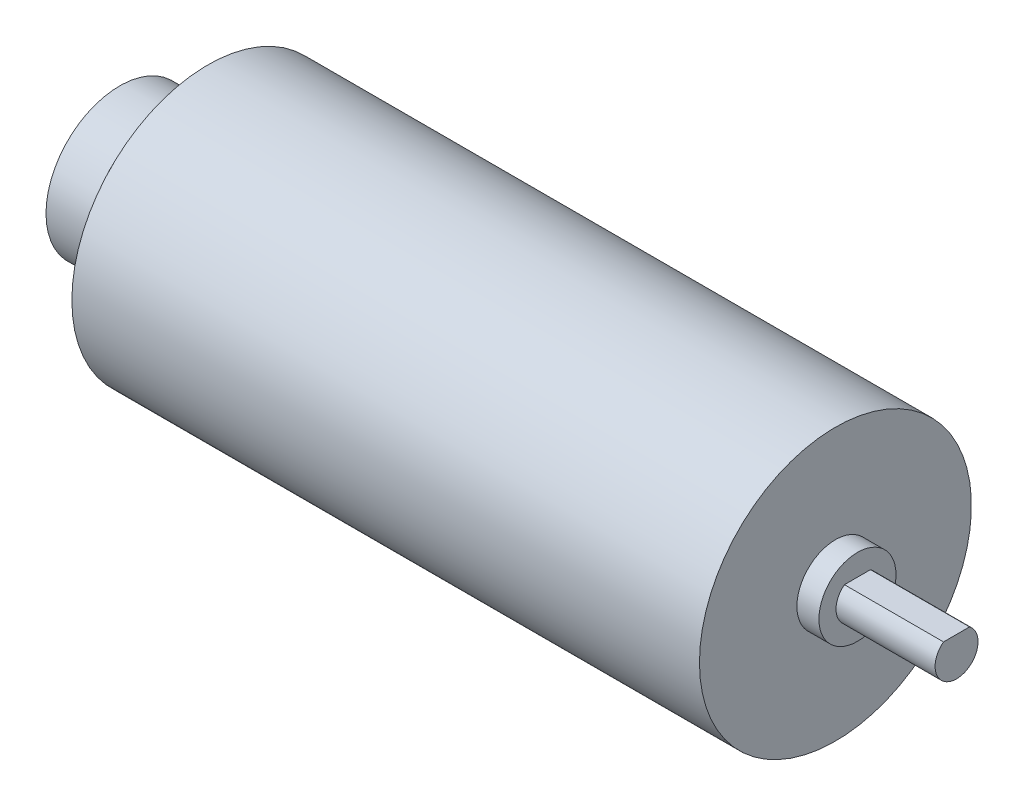
ISO-10303-21;
HEADER;
FILE_DESCRIPTION(('STEP AP214'),'2;1');
FILE_NAME('part.step','',(''),(''),'','','');
FILE_SCHEMA(('AUTOMOTIVE_DESIGN { 1 0 10303 214 1 1 1 1 }'));
ENDSEC;
DATA;
#1=APPLICATION_CONTEXT('core data for automotive mechanical design processes');
#2=APPLICATION_PROTOCOL_DEFINITION('international standard','automotive_design',2000,#1);
#3=PRODUCT_CONTEXT('',#1,'mechanical');
#4=PRODUCT('Part','Part','',(#3));
#5=PRODUCT_RELATED_PRODUCT_CATEGORY('part','',(#4));
#6=PRODUCT_DEFINITION_FORMATION('','',#4);
#7=PRODUCT_DEFINITION_CONTEXT('part definition',#1,'design');
#8=PRODUCT_DEFINITION('design','',#6,#7);
#9=PRODUCT_DEFINITION_SHAPE('','',#8);
#10=(LENGTH_UNIT() NAMED_UNIT(*) SI_UNIT(.MILLI.,.METRE.));
#11=(NAMED_UNIT(*) PLANE_ANGLE_UNIT() SI_UNIT($,.RADIAN.));
#12=(NAMED_UNIT(*) SI_UNIT($,.STERADIAN.) SOLID_ANGLE_UNIT());
#13=UNCERTAINTY_MEASURE_WITH_UNIT(LENGTH_MEASURE(1.E-05),#10,'distance_accuracy_value','');
#14=(GEOMETRIC_REPRESENTATION_CONTEXT(3) GLOBAL_UNCERTAINTY_ASSIGNED_CONTEXT((#13)) GLOBAL_UNIT_ASSIGNED_CONTEXT((#10,
#11,#12)) REPRESENTATION_CONTEXT('',''));
#15=CARTESIAN_POINT('',(0.,0.,0.));
#16=DIRECTION('',(0.,0.,1.));
#17=DIRECTION('',(1.,0.,0.));
#18=AXIS2_PLACEMENT_3D('',#15,#16,#17);
#19=CARTESIAN_POINT('',(30.5,0.,0.));
#20=DIRECTION('',(1.,0.,0.));
#21=DIRECTION('',(0.,0.,-1.));
#22=AXIS2_PLACEMENT_3D('',#19,#20,#21);
#23=PLANE('',#22);
#24=CARTESIAN_POINT('',(30.5,0.,0.));
#25=DIRECTION('',(1.,0.,0.));
#26=DIRECTION('',(0.,0.,-1.));
#27=AXIS2_PLACEMENT_3D('',#24,#25,#26);
#28=CIRCLE('',#27,3.5);
#29=CARTESIAN_POINT('',(30.5,0.,-3.5));
#30=VERTEX_POINT('',#29);
#31=EDGE_CURVE('E87',#30,#30,#28,.T.);
#32=ORIENTED_EDGE('',*,*,#31,.T.);
#33=EDGE_LOOP('',(#32));
#34=FACE_BOUND('',#33,.T.);
#35=DIRECTION('',(0.,0.,-1.));
#36=VECTOR('',#35,1.);
#37=CARTESIAN_POINT('',(30.5,1.55,0.));
#38=LINE('',#37,#36);
#39=CARTESIAN_POINT('',(30.5,1.55,1.18321595661992));
#40=VERTEX_POINT('',#39);
#41=CARTESIAN_POINT('',(30.5,1.55,-1.18321595661992));
#42=VERTEX_POINT('',#41);
#43=EDGE_CURVE('E48',#40,#42,#38,.T.);
#44=ORIENTED_EDGE('',*,*,#43,.T.);
#45=CARTESIAN_POINT('',(30.5,0.,0.));
#46=DIRECTION('',(1.,0.,0.));
#47=DIRECTION('',(0.,0.,-1.));
#48=AXIS2_PLACEMENT_3D('',#45,#46,#47);
#49=CIRCLE('',#48,1.95);
#50=EDGE_CURVE('E69',#40,#42,#49,.T.);
#51=ORIENTED_EDGE('',*,*,#50,.F.);
#52=EDGE_LOOP('',(#44,#51));
#53=FACE_BOUND('',#52,.T.);
#54=ADVANCED_FACE('F33',(#34,#53),#23,.T.);
#55=CARTESIAN_POINT('',(-28.5,0.,-12.35));
#56=DIRECTION('',(1.,0.,0.));
#57=DIRECTION('',(0.,0.,-1.));
#58=AXIS2_PLACEMENT_3D('',#55,#56,#57);
#59=PLANE('',#58);
#60=CARTESIAN_POINT('',(-28.5,0.,0.));
#61=DIRECTION('',(1.,0.,0.));
#62=DIRECTION('',(0.,0.,-1.));
#63=AXIS2_PLACEMENT_3D('',#60,#61,#62);
#64=CIRCLE('',#63,0.75);
#65=CARTESIAN_POINT('',(-28.5,0.,-0.75));
#66=VERTEX_POINT('',#65);
#67=EDGE_CURVE('E11',#66,#66,#64,.F.);
#68=ORIENTED_EDGE('',*,*,#67,.F.);
#69=EDGE_LOOP('',(#68));
#70=FACE_BOUND('',#69,.T.);
#71=CARTESIAN_POINT('',(-28.5,0.,0.));
#72=DIRECTION('',(-1.,0.,0.));
#73=DIRECTION('',(0.,0.,1.));
#74=AXIS2_PLACEMENT_3D('',#71,#72,#73);
#75=CIRCLE('',#74,12.35);
#76=CARTESIAN_POINT('',(-28.5,0.,12.35));
#77=VERTEX_POINT('',#76);
#78=EDGE_CURVE('E90',#77,#77,#75,.T.);
#79=ORIENTED_EDGE('',*,*,#78,.T.);
#80=EDGE_LOOP('',(#79));
#81=FACE_BOUND('',#80,.T.);
#82=ADVANCED_FACE('F35',(#70,#81),#59,.F.);
#83=CARTESIAN_POINT('',(28.5,0.,-12.35));
#84=DIRECTION('',(-1.,0.,0.));
#85=DIRECTION('',(0.,0.,1.));
#86=AXIS2_PLACEMENT_3D('',#83,#84,#85);
#87=PLANE('',#86);
#88=CARTESIAN_POINT('',(28.5,0.,0.));
#89=DIRECTION('',(-1.,0.,0.));
#90=DIRECTION('',(0.,0.,1.));
#91=AXIS2_PLACEMENT_3D('',#88,#89,#90);
#92=CIRCLE('',#91,3.5);
#93=CARTESIAN_POINT('',(28.5,0.,3.5));
#94=VERTEX_POINT('',#93);
#95=EDGE_CURVE('E41',#94,#94,#92,.F.);
#96=ORIENTED_EDGE('',*,*,#95,.F.);
#97=EDGE_LOOP('',(#96));
#98=FACE_BOUND('',#97,.T.);
#99=CARTESIAN_POINT('',(28.5,0.,0.));
#100=DIRECTION('',(-1.,0.,0.));
#101=DIRECTION('',(0.,0.,1.));
#102=AXIS2_PLACEMENT_3D('',#99,#100,#101);
#103=CIRCLE('',#102,12.35);
#104=CARTESIAN_POINT('',(28.5,0.,12.35));
#105=VERTEX_POINT('',#104);
#106=EDGE_CURVE('E93',#105,#105,#103,.T.);
#107=ORIENTED_EDGE('',*,*,#106,.F.);
#108=EDGE_LOOP('',(#107));
#109=FACE_BOUND('',#108,.T.);
#110=ADVANCED_FACE('F100',(#98,#109),#87,.F.);
#111=CARTESIAN_POINT('',(-28.5,0.,0.));
#112=DIRECTION('',(-1.,0.,0.));
#113=DIRECTION('',(0.,0.,1.));
#114=AXIS2_PLACEMENT_3D('',#111,#112,#113);
#115=CYLINDRICAL_SURFACE('',#114,12.35);
#116=ORIENTED_EDGE('',*,*,#78,.F.);
#117=EDGE_LOOP('',(#116));
#118=FACE_BOUND('',#117,.T.);
#119=ORIENTED_EDGE('',*,*,#106,.T.);
#120=EDGE_LOOP('',(#119));
#121=FACE_BOUND('',#120,.T.);
#122=ADVANCED_FACE('F103',(#118,#121),#115,.T.);
#123=CARTESIAN_POINT('',(30.5,0.,0.));
#124=DIRECTION('',(-1.,0.,0.));
#125=DIRECTION('',(0.,0.,1.));
#126=AXIS2_PLACEMENT_3D('',#123,#124,#125);
#127=CYLINDRICAL_SURFACE('',#126,3.5);
#128=ORIENTED_EDGE('',*,*,#31,.F.);
#129=EDGE_LOOP('',(#128));
#130=FACE_BOUND('',#129,.T.);
#131=ORIENTED_EDGE('',*,*,#95,.T.);
#132=EDGE_LOOP('',(#131));
#133=FACE_BOUND('',#132,.T.);
#134=ADVANCED_FACE('F98',(#130,#133),#127,.T.);
#135=CARTESIAN_POINT('',(-32.5,0.,0.));
#136=DIRECTION('',(1.,0.,0.));
#137=DIRECTION('',(0.,0.,-1.));
#138=AXIS2_PLACEMENT_3D('',#135,#136,#137);
#139=CYLINDRICAL_SURFACE('',#138,0.75);
#140=CARTESIAN_POINT('',(-32.5,0.,0.));
#141=DIRECTION('',(-1.,0.,0.));
#142=DIRECTION('',(0.,0.,1.));
#143=AXIS2_PLACEMENT_3D('',#140,#141,#142);
#144=CIRCLE('',#143,0.75);
#145=CARTESIAN_POINT('',(-32.5,0.,0.75));
#146=VERTEX_POINT('',#145);
#147=EDGE_CURVE('E82',#146,#146,#144,.T.);
#148=ORIENTED_EDGE('',*,*,#147,.F.);
#149=EDGE_LOOP('',(#148));
#150=FACE_BOUND('',#149,.T.);
#151=ORIENTED_EDGE('',*,*,#67,.T.);
#152=EDGE_LOOP('',(#151));
#153=FACE_BOUND('',#152,.T.);
#154=ADVANCED_FACE('F112',(#150,#153),#139,.T.);
#155=CARTESIAN_POINT('',(-36.5,0.,0.));
#156=DIRECTION('',(1.,0.,0.));
#157=DIRECTION('',(0.,0.,-1.));
#158=AXIS2_PLACEMENT_3D('',#155,#156,#157);
#159=CYLINDRICAL_SURFACE('',#158,6.7);
#160=CARTESIAN_POINT('',(-36.5,0.,0.));
#161=DIRECTION('',(-1.,0.,0.));
#162=DIRECTION('',(0.,0.,1.));
#163=AXIS2_PLACEMENT_3D('',#160,#161,#162);
#164=CIRCLE('',#163,6.7);
#165=CARTESIAN_POINT('',(-36.5,0.,6.7));
#166=VERTEX_POINT('',#165);
#167=EDGE_CURVE('E79',#166,#166,#164,.T.);
#168=ORIENTED_EDGE('',*,*,#167,.F.);
#169=EDGE_LOOP('',(#168));
#170=FACE_BOUND('',#169,.T.);
#171=CARTESIAN_POINT('',(-32.5,0.,0.));
#172=DIRECTION('',(-1.,0.,0.));
#173=DIRECTION('',(0.,0.,1.));
#174=AXIS2_PLACEMENT_3D('',#171,#172,#173);
#175=CIRCLE('',#174,6.7);
#176=CARTESIAN_POINT('',(-32.5,0.,6.7));
#177=VERTEX_POINT('',#176);
#178=EDGE_CURVE('E78',#177,#177,#175,.T.);
#179=ORIENTED_EDGE('',*,*,#178,.T.);
#180=EDGE_LOOP('',(#179));
#181=FACE_BOUND('',#180,.T.);
#182=ADVANCED_FACE('F126',(#170,#181),#159,.T.);
#183=CARTESIAN_POINT('',(-36.5,0.,0.));
#184=DIRECTION('',(-1.,0.,0.));
#185=DIRECTION('',(0.,0.,1.));
#186=AXIS2_PLACEMENT_3D('',#183,#184,#185);
#187=PLANE('',#186);
#188=ORIENTED_EDGE('',*,*,#167,.T.);
#189=EDGE_LOOP('',(#188));
#190=FACE_BOUND('',#189,.T.);
#191=ADVANCED_FACE('F130',(#190),#187,.T.);
#192=CARTESIAN_POINT('',(-32.5,0.,0.));
#193=DIRECTION('',(-1.,0.,0.));
#194=DIRECTION('',(0.,0.,1.));
#195=AXIS2_PLACEMENT_3D('',#192,#193,#194);
#196=PLANE('',#195);
#197=ORIENTED_EDGE('',*,*,#147,.T.);
#198=EDGE_LOOP('',(#197));
#199=FACE_BOUND('',#198,.T.);
#200=ORIENTED_EDGE('',*,*,#178,.F.);
#201=EDGE_LOOP('',(#200));
#202=FACE_BOUND('',#201,.T.);
#203=ADVANCED_FACE('F132',(#199,#202),#196,.F.);
#204=CARTESIAN_POINT('',(39.5,1.55,0.));
#205=DIRECTION('',(0.,1.,0.));
#206=DIRECTION('',(0.,0.,1.));
#207=AXIS2_PLACEMENT_3D('',#204,#205,#206);
#208=PLANE('',#207);
#209=ORIENTED_EDGE('',*,*,#43,.F.);
#210=DIRECTION('',(-1.,0.,0.));
#211=VECTOR('',#210,1.);
#212=CARTESIAN_POINT('',(39.5,1.55,1.18321595661992));
#213=LINE('',#212,#211);
#214=CARTESIAN_POINT('',(39.5,1.55,1.18321595661992));
#215=VERTEX_POINT('',#214);
#216=EDGE_CURVE('E66',#215,#40,#213,.T.);
#217=ORIENTED_EDGE('',*,*,#216,.F.);
#218=DIRECTION('',(0.,0.,-1.));
#219=VECTOR('',#218,1.);
#220=CARTESIAN_POINT('',(39.5,1.55,0.));
#221=LINE('',#220,#219);
#222=CARTESIAN_POINT('',(39.5,1.55,-1.18321595661992));
#223=VERTEX_POINT('',#222);
#224=EDGE_CURVE('E64',#215,#223,#221,.T.);
#225=ORIENTED_EDGE('',*,*,#224,.T.);
#226=DIRECTION('',(-1.,0.,0.));
#227=VECTOR('',#226,1.);
#228=CARTESIAN_POINT('',(39.5,1.55,-1.18321595661992));
#229=LINE('',#228,#227);
#230=EDGE_CURVE('E61',#223,#42,#229,.T.);
#231=ORIENTED_EDGE('',*,*,#230,.T.);
#232=EDGE_LOOP('',(#209,#217,#225,#231));
#233=FACE_BOUND('',#232,.T.);
#234=ADVANCED_FACE('F63',(#233),#208,.T.);
#235=CARTESIAN_POINT('',(39.5,0.,0.));
#236=DIRECTION('',(-1.,0.,0.));
#237=DIRECTION('',(0.,0.,1.));
#238=AXIS2_PLACEMENT_3D('',#235,#236,#237);
#239=CYLINDRICAL_SURFACE('',#238,1.95);
#240=ORIENTED_EDGE('',*,*,#50,.T.);
#241=ORIENTED_EDGE('',*,*,#230,.F.);
#242=CARTESIAN_POINT('',(39.5,0.,0.));
#243=DIRECTION('',(1.,0.,0.));
#244=DIRECTION('',(0.,0.,-1.));
#245=AXIS2_PLACEMENT_3D('',#242,#243,#244);
#246=CIRCLE('',#245,1.95);
#247=EDGE_CURVE('E56',#215,#223,#246,.T.);
#248=ORIENTED_EDGE('',*,*,#247,.F.);
#249=ORIENTED_EDGE('',*,*,#216,.T.);
#250=EDGE_LOOP('',(#240,#241,#248,#249));
#251=FACE_BOUND('',#250,.T.);
#252=ADVANCED_FACE('F70',(#251),#239,.T.);
#253=CARTESIAN_POINT('',(39.5,0.,0.));
#254=DIRECTION('',(1.,0.,0.));
#255=DIRECTION('',(0.,0.,-1.));
#256=AXIS2_PLACEMENT_3D('',#253,#254,#255);
#257=PLANE('',#256);
#258=ORIENTED_EDGE('',*,*,#224,.F.);
#259=ORIENTED_EDGE('',*,*,#247,.T.);
#260=EDGE_LOOP('',(#258,#259));
#261=FACE_BOUND('',#260,.T.);
#262=ADVANCED_FACE('F143',(#261),#257,.T.);
#263=CLOSED_SHELL('',(#54,#82,#110,#122,#134,#154,#182,#191,#203,#234,#252,#262));
#264=MANIFOLD_SOLID_BREP('B2',#263);
#265=ADVANCED_BREP_SHAPE_REPRESENTATION('',(#18,#264),#14);
#266=SHAPE_DEFINITION_REPRESENTATION(#9,#265);
ENDSEC;
END-ISO-10303-21;
